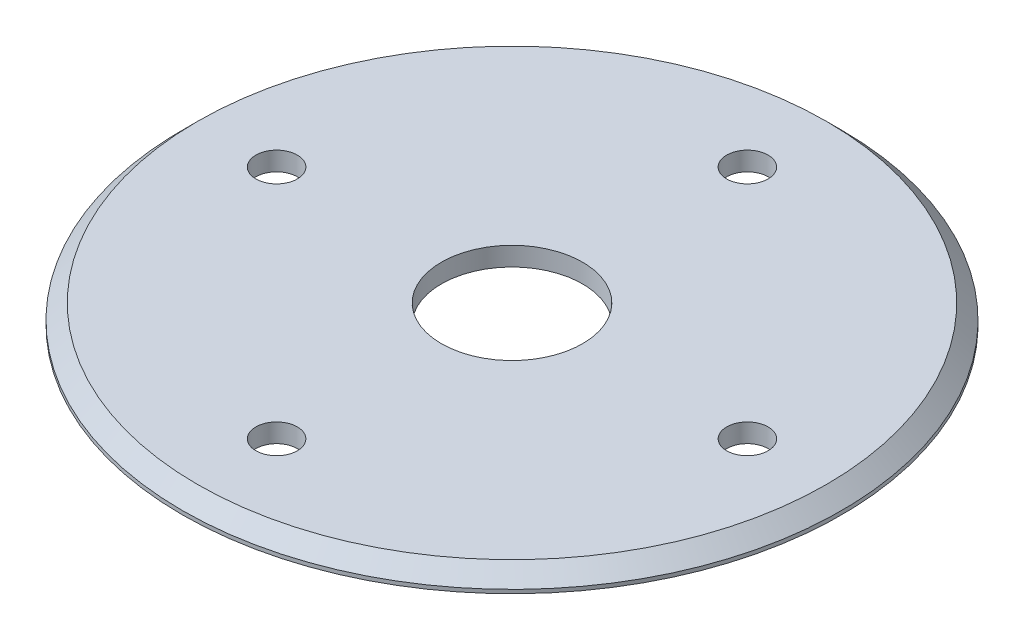
ISO-10303-21;
HEADER;
FILE_DESCRIPTION(('STEP AP214'),'2;1');
FILE_NAME('part.step','',(''),(''),'','','');
FILE_SCHEMA(('AUTOMOTIVE_DESIGN { 1 0 10303 214 1 1 1 1 }'));
ENDSEC;
DATA;
#1=APPLICATION_CONTEXT('core data for automotive mechanical design processes');
#2=APPLICATION_PROTOCOL_DEFINITION('international standard','automotive_design',2000,#1);
#3=PRODUCT_CONTEXT('',#1,'mechanical');
#4=PRODUCT('Part','Part','',(#3));
#5=PRODUCT_RELATED_PRODUCT_CATEGORY('part','',(#4));
#6=PRODUCT_DEFINITION_FORMATION('','',#4);
#7=PRODUCT_DEFINITION_CONTEXT('part definition',#1,'design');
#8=PRODUCT_DEFINITION('design','',#6,#7);
#9=PRODUCT_DEFINITION_SHAPE('','',#8);
#10=(LENGTH_UNIT() NAMED_UNIT(*) SI_UNIT(.MILLI.,.METRE.));
#11=(NAMED_UNIT(*) PLANE_ANGLE_UNIT() SI_UNIT($,.RADIAN.));
#12=(NAMED_UNIT(*) SI_UNIT($,.STERADIAN.) SOLID_ANGLE_UNIT());
#13=UNCERTAINTY_MEASURE_WITH_UNIT(LENGTH_MEASURE(1.E-05),#10,'distance_accuracy_value','');
#14=(GEOMETRIC_REPRESENTATION_CONTEXT(3) GLOBAL_UNCERTAINTY_ASSIGNED_CONTEXT((#13)) GLOBAL_UNIT_ASSIGNED_CONTEXT((#10,
#11,#12)) REPRESENTATION_CONTEXT('',''));
#15=CARTESIAN_POINT('',(0.,0.,0.));
#16=DIRECTION('',(0.,0.,1.));
#17=DIRECTION('',(1.,0.,0.));
#18=AXIS2_PLACEMENT_3D('',#15,#16,#17);
#19=CARTESIAN_POINT('',(0.,2.,0.));
#20=DIRECTION('',(0.,1.,0.));
#21=DIRECTION('',(0.,0.,1.));
#22=AXIS2_PLACEMENT_3D('',#19,#20,#21);
#23=PLANE('',#22);
#24=CARTESIAN_POINT('',(0.,2.,0.));
#25=DIRECTION('',(0.,1.,0.));
#26=DIRECTION('',(0.,0.,1.));
#27=AXIS2_PLACEMENT_3D('',#24,#25,#26);
#28=CIRCLE('',#27,33.4);
#29=CARTESIAN_POINT('',(0.,2.,33.4));
#30=VERTEX_POINT('',#29);
#31=EDGE_CURVE('E39',#30,#30,#28,.T.);
#32=ORIENTED_EDGE('',*,*,#31,.T.);
#33=EDGE_LOOP('',(#32));
#34=FACE_BOUND('',#33,.T.);
#35=CARTESIAN_POINT('',(1.41496223752446E-12,2.,25.));
#36=DIRECTION('',(0.,1.,0.));
#37=DIRECTION('',(0.,0.,1.));
#38=AXIS2_PLACEMENT_3D('',#35,#36,#37);
#39=CIRCLE('',#38,2.20000000000152);
#40=CARTESIAN_POINT('',(1.41496223752446E-12,2.,27.2000000000015));
#41=VERTEX_POINT('',#40);
#42=EDGE_CURVE('E65',#41,#41,#39,.T.);
#43=ORIENTED_EDGE('',*,*,#42,.F.);
#44=EDGE_LOOP('',(#43));
#45=FACE_BOUND('',#44,.T.);
#46=CARTESIAN_POINT('',(0.,2.,0.));
#47=DIRECTION('',(0.,1.,0.));
#48=DIRECTION('',(0.,0.,1.));
#49=AXIS2_PLACEMENT_3D('',#46,#47,#48);
#50=CIRCLE('',#49,7.5);
#51=CARTESIAN_POINT('',(0.,2.,7.5));
#52=VERTEX_POINT('',#51);
#53=EDGE_CURVE('E53',#52,#52,#50,.T.);
#54=ORIENTED_EDGE('',*,*,#53,.F.);
#55=EDGE_LOOP('',(#54));
#56=FACE_BOUND('',#55,.T.);
#57=CARTESIAN_POINT('',(0.,2.,-25.));
#58=DIRECTION('',(0.,1.,0.));
#59=DIRECTION('',(0.,0.,1.));
#60=AXIS2_PLACEMENT_3D('',#57,#58,#59);
#61=CIRCLE('',#60,2.2);
#62=CARTESIAN_POINT('',(0.,2.,-22.8));
#63=VERTEX_POINT('',#62);
#64=EDGE_CURVE('E47',#63,#63,#61,.T.);
#65=ORIENTED_EDGE('',*,*,#64,.F.);
#66=EDGE_LOOP('',(#65));
#67=FACE_BOUND('',#66,.T.);
#68=CARTESIAN_POINT('',(25.0000000000007,2.,-7.07481118762232E-13));
#69=DIRECTION('',(0.,1.,0.));
#70=DIRECTION('',(0.,0.,1.));
#71=AXIS2_PLACEMENT_3D('',#68,#69,#70);
#72=CIRCLE('',#71,2.20000000000055);
#73=CARTESIAN_POINT('',(25.0000000000007,2.,2.19999999999985));
#74=VERTEX_POINT('',#73);
#75=EDGE_CURVE('E59',#74,#74,#72,.T.);
#76=ORIENTED_EDGE('',*,*,#75,.F.);
#77=EDGE_LOOP('',(#76));
#78=FACE_BOUND('',#77,.T.);
#79=CARTESIAN_POINT('',(-24.9999999999993,2.,7.105427357601E-13));
#80=DIRECTION('',(0.,1.,0.));
#81=DIRECTION('',(0.,0.,1.));
#82=AXIS2_PLACEMENT_3D('',#79,#80,#81);
#83=CIRCLE('',#82,2.20000000000114);
#84=CARTESIAN_POINT('',(-24.9999999999993,2.,2.20000000000185));
#85=VERTEX_POINT('',#84);
#86=EDGE_CURVE('E71',#85,#85,#83,.T.);
#87=ORIENTED_EDGE('',*,*,#86,.F.);
#88=EDGE_LOOP('',(#87));
#89=FACE_BOUND('',#88,.T.);
#90=ADVANCED_FACE('F32',(#34,#45,#56,#67,#78,#89),#23,.T.);
#91=CARTESIAN_POINT('',(0.,0.,0.));
#92=DIRECTION('',(0.,1.,0.));
#93=DIRECTION('',(0.,0.,1.));
#94=AXIS2_PLACEMENT_3D('',#91,#92,#93);
#95=PLANE('',#94);
#96=CARTESIAN_POINT('',(0.,0.,0.));
#97=DIRECTION('',(0.,1.,0.));
#98=DIRECTION('',(0.,0.,1.));
#99=AXIS2_PLACEMENT_3D('',#96,#97,#98);
#100=CIRCLE('',#99,35.);
#101=CARTESIAN_POINT('',(0.,0.,35.));
#102=VERTEX_POINT('',#101);
#103=EDGE_CURVE('E43',#102,#102,#100,.T.);
#104=ORIENTED_EDGE('',*,*,#103,.F.);
#105=EDGE_LOOP('',(#104));
#106=FACE_BOUND('',#105,.T.);
#107=CARTESIAN_POINT('',(0.,0.,-25.));
#108=DIRECTION('',(0.,1.,0.));
#109=DIRECTION('',(0.,0.,1.));
#110=AXIS2_PLACEMENT_3D('',#107,#108,#109);
#111=CIRCLE('',#110,2.2);
#112=CARTESIAN_POINT('',(0.,0.,-22.8));
#113=VERTEX_POINT('',#112);
#114=EDGE_CURVE('E50',#113,#113,#111,.T.);
#115=ORIENTED_EDGE('',*,*,#114,.T.);
#116=EDGE_LOOP('',(#115));
#117=FACE_BOUND('',#116,.T.);
#118=CARTESIAN_POINT('',(0.,0.,0.));
#119=DIRECTION('',(0.,1.,0.));
#120=DIRECTION('',(0.,0.,1.));
#121=AXIS2_PLACEMENT_3D('',#118,#119,#120);
#122=CIRCLE('',#121,7.5);
#123=CARTESIAN_POINT('',(0.,0.,7.5));
#124=VERTEX_POINT('',#123);
#125=EDGE_CURVE('E56',#124,#124,#122,.T.);
#126=ORIENTED_EDGE('',*,*,#125,.T.);
#127=EDGE_LOOP('',(#126));
#128=FACE_BOUND('',#127,.T.);
#129=CARTESIAN_POINT('',(25.0000000000007,0.,-7.07481118762232E-13));
#130=DIRECTION('',(0.,1.,0.));
#131=DIRECTION('',(0.,0.,1.));
#132=AXIS2_PLACEMENT_3D('',#129,#130,#131);
#133=CIRCLE('',#132,2.20000000000055);
#134=CARTESIAN_POINT('',(25.0000000000007,0.,2.19999999999985));
#135=VERTEX_POINT('',#134);
#136=EDGE_CURVE('E62',#135,#135,#133,.T.);
#137=ORIENTED_EDGE('',*,*,#136,.T.);
#138=EDGE_LOOP('',(#137));
#139=FACE_BOUND('',#138,.T.);
#140=CARTESIAN_POINT('',(1.41496223752446E-12,0.,25.));
#141=DIRECTION('',(0.,1.,0.));
#142=DIRECTION('',(0.,0.,1.));
#143=AXIS2_PLACEMENT_3D('',#140,#141,#142);
#144=CIRCLE('',#143,2.20000000000152);
#145=CARTESIAN_POINT('',(1.41496223752446E-12,0.,27.2000000000015));
#146=VERTEX_POINT('',#145);
#147=EDGE_CURVE('E68',#146,#146,#144,.T.);
#148=ORIENTED_EDGE('',*,*,#147,.T.);
#149=EDGE_LOOP('',(#148));
#150=FACE_BOUND('',#149,.T.);
#151=CARTESIAN_POINT('',(-24.9999999999993,0.,7.105427357601E-13));
#152=DIRECTION('',(0.,1.,0.));
#153=DIRECTION('',(0.,0.,1.));
#154=AXIS2_PLACEMENT_3D('',#151,#152,#153);
#155=CIRCLE('',#154,2.20000000000114);
#156=CARTESIAN_POINT('',(-24.9999999999993,0.,2.20000000000185));
#157=VERTEX_POINT('',#156);
#158=EDGE_CURVE('E74',#157,#157,#155,.T.);
#159=ORIENTED_EDGE('',*,*,#158,.T.);
#160=EDGE_LOOP('',(#159));
#161=FACE_BOUND('',#160,.T.);
#162=ADVANCED_FACE('F84',(#106,#117,#128,#139,#150,#161),#95,.F.);
#163=CARTESIAN_POINT('',(0.,2.,0.));
#164=DIRECTION('',(0.,-1.,0.));
#165=DIRECTION('',(0.,0.,-1.));
#166=AXIS2_PLACEMENT_3D('',#163,#164,#165);
#167=CYLINDRICAL_SURFACE('',#166,35.);
#168=CARTESIAN_POINT('',(0.,0.399999999999989,0.));
#169=DIRECTION('',(0.,1.,0.));
#170=DIRECTION('',(0.,0.,1.));
#171=AXIS2_PLACEMENT_3D('',#168,#169,#170);
#172=CIRCLE('',#171,35.);
#173=CARTESIAN_POINT('',(0.,0.399999999999989,35.));
#174=VERTEX_POINT('',#173);
#175=EDGE_CURVE('E10',#174,#174,#172,.F.);
#176=ORIENTED_EDGE('',*,*,#175,.T.);
#177=EDGE_LOOP('',(#176));
#178=FACE_BOUND('',#177,.T.);
#179=ORIENTED_EDGE('',*,*,#103,.T.);
#180=EDGE_LOOP('',(#179));
#181=FACE_BOUND('',#180,.T.);
#182=ADVANCED_FACE('F89',(#178,#181),#167,.T.);
#183=CARTESIAN_POINT('',(0.,2.,-25.));
#184=DIRECTION('',(0.,-1.,0.));
#185=DIRECTION('',(0.,0.,-1.));
#186=AXIS2_PLACEMENT_3D('',#183,#184,#185);
#187=CYLINDRICAL_SURFACE('',#186,2.2);
#188=ORIENTED_EDGE('',*,*,#64,.T.);
#189=EDGE_LOOP('',(#188));
#190=FACE_BOUND('',#189,.T.);
#191=ORIENTED_EDGE('',*,*,#114,.F.);
#192=EDGE_LOOP('',(#191));
#193=FACE_BOUND('',#192,.T.);
#194=ADVANCED_FACE('F94',(#190,#193),#187,.F.);
#195=CARTESIAN_POINT('',(0.,2.,0.));
#196=DIRECTION('',(0.,-1.,0.));
#197=DIRECTION('',(0.,0.,-1.));
#198=AXIS2_PLACEMENT_3D('',#195,#196,#197);
#199=CYLINDRICAL_SURFACE('',#198,7.5);
#200=ORIENTED_EDGE('',*,*,#53,.T.);
#201=EDGE_LOOP('',(#200));
#202=FACE_BOUND('',#201,.T.);
#203=ORIENTED_EDGE('',*,*,#125,.F.);
#204=EDGE_LOOP('',(#203));
#205=FACE_BOUND('',#204,.T.);
#206=ADVANCED_FACE('F100',(#202,#205),#199,.F.);
#207=CARTESIAN_POINT('',(25.0000000000007,2.,-7.07481118762232E-13));
#208=DIRECTION('',(0.,-1.,0.));
#209=DIRECTION('',(0.,0.,-1.));
#210=AXIS2_PLACEMENT_3D('',#207,#208,#209);
#211=CYLINDRICAL_SURFACE('',#210,2.20000000000055);
#212=ORIENTED_EDGE('',*,*,#75,.T.);
#213=EDGE_LOOP('',(#212));
#214=FACE_BOUND('',#213,.T.);
#215=ORIENTED_EDGE('',*,*,#136,.F.);
#216=EDGE_LOOP('',(#215));
#217=FACE_BOUND('',#216,.T.);
#218=ADVANCED_FACE('F122',(#214,#217),#211,.F.);
#219=CARTESIAN_POINT('',(1.41496223752446E-12,2.,25.));
#220=DIRECTION('',(0.,-1.,0.));
#221=DIRECTION('',(0.,0.,-1.));
#222=AXIS2_PLACEMENT_3D('',#219,#220,#221);
#223=CYLINDRICAL_SURFACE('',#222,2.20000000000152);
#224=ORIENTED_EDGE('',*,*,#42,.T.);
#225=EDGE_LOOP('',(#224));
#226=FACE_BOUND('',#225,.T.);
#227=ORIENTED_EDGE('',*,*,#147,.F.);
#228=EDGE_LOOP('',(#227));
#229=FACE_BOUND('',#228,.T.);
#230=ADVANCED_FACE('F115',(#226,#229),#223,.F.);
#231=CARTESIAN_POINT('',(-24.9999999999993,2.,7.105427357601E-13));
#232=DIRECTION('',(0.,-1.,0.));
#233=DIRECTION('',(0.,0.,-1.));
#234=AXIS2_PLACEMENT_3D('',#231,#232,#233);
#235=CYLINDRICAL_SURFACE('',#234,2.20000000000114);
#236=ORIENTED_EDGE('',*,*,#86,.T.);
#237=EDGE_LOOP('',(#236));
#238=FACE_BOUND('',#237,.T.);
#239=ORIENTED_EDGE('',*,*,#158,.F.);
#240=EDGE_LOOP('',(#239));
#241=FACE_BOUND('',#240,.T.);
#242=ADVANCED_FACE('F80',(#238,#241),#235,.F.);
#243=CARTESIAN_POINT('',(0.,2.,0.));
#244=DIRECTION('',(0.,-1.,0.));
#245=DIRECTION('',(0.,0.,-1.));
#246=AXIS2_PLACEMENT_3D('',#243,#244,#245);
#247=CONICAL_SURFACE('',#246,33.4,0.785398163397446);
#248=ORIENTED_EDGE('',*,*,#175,.F.);
#249=EDGE_LOOP('',(#248));
#250=FACE_BOUND('',#249,.T.);
#251=ORIENTED_EDGE('',*,*,#31,.F.);
#252=EDGE_LOOP('',(#251));
#253=FACE_BOUND('',#252,.T.);
#254=ADVANCED_FACE('F34',(#250,#253),#247,.T.);
#255=CLOSED_SHELL('',(#90,#162,#182,#194,#206,#218,#230,#242,#254));
#256=MANIFOLD_SOLID_BREP('B2',#255);
#257=ADVANCED_BREP_SHAPE_REPRESENTATION('',(#18,#256),#14);
#258=SHAPE_DEFINITION_REPRESENTATION(#9,#257);
ENDSEC;
END-ISO-10303-21;
